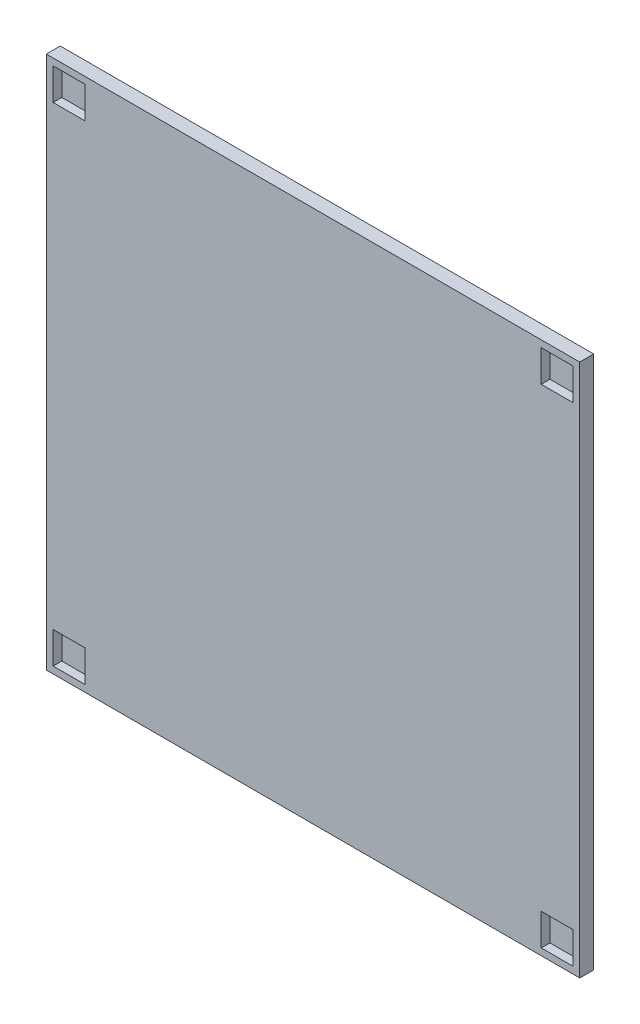
ISO-10303-21;
HEADER;
FILE_DESCRIPTION(('STEP AP214'),'2;1');
FILE_NAME('part.step','',(''),(''),'','','');
FILE_SCHEMA(('AUTOMOTIVE_DESIGN { 1 0 10303 214 1 1 1 1 }'));
ENDSEC;
DATA;
#1=APPLICATION_CONTEXT('core data for automotive mechanical design processes');
#2=APPLICATION_PROTOCOL_DEFINITION('international standard','automotive_design',2000,#1);
#3=PRODUCT_CONTEXT('',#1,'mechanical');
#4=PRODUCT('Part','Part','',(#3));
#5=PRODUCT_RELATED_PRODUCT_CATEGORY('part','',(#4));
#6=PRODUCT_DEFINITION_FORMATION('','',#4);
#7=PRODUCT_DEFINITION_CONTEXT('part definition',#1,'design');
#8=PRODUCT_DEFINITION('design','',#6,#7);
#9=PRODUCT_DEFINITION_SHAPE('','',#8);
#10=(LENGTH_UNIT() NAMED_UNIT(*) SI_UNIT(.MILLI.,.METRE.));
#11=(NAMED_UNIT(*) PLANE_ANGLE_UNIT() SI_UNIT($,.RADIAN.));
#12=(NAMED_UNIT(*) SI_UNIT($,.STERADIAN.) SOLID_ANGLE_UNIT());
#13=UNCERTAINTY_MEASURE_WITH_UNIT(LENGTH_MEASURE(1.E-05),#10,'distance_accuracy_value','');
#14=(GEOMETRIC_REPRESENTATION_CONTEXT(3) GLOBAL_UNCERTAINTY_ASSIGNED_CONTEXT((#13)) GLOBAL_UNIT_ASSIGNED_CONTEXT((#10,
#11,#12)) REPRESENTATION_CONTEXT('',''));
#15=CARTESIAN_POINT('',(0.,0.,0.));
#16=DIRECTION('',(0.,0.,1.));
#17=DIRECTION('',(1.,0.,0.));
#18=AXIS2_PLACEMENT_3D('',#15,#16,#17);
#19=CARTESIAN_POINT('',(-153.,-153.,8.));
#20=DIRECTION('',(1.,0.,0.));
#21=DIRECTION('',(0.,0.,-1.));
#22=AXIS2_PLACEMENT_3D('',#19,#20,#21);
#23=PLANE('',#22);
#24=DIRECTION('',(0.,-1.,0.));
#25=VECTOR('',#24,1.);
#26=CARTESIAN_POINT('',(-153.,-153.,0.));
#27=LINE('',#26,#25);
#28=CARTESIAN_POINT('',(-153.,153.,0.));
#29=VERTEX_POINT('',#28);
#30=CARTESIAN_POINT('',(-153.,-153.,0.));
#31=VERTEX_POINT('',#30);
#32=EDGE_CURVE('E302',#29,#31,#27,.T.);
#33=ORIENTED_EDGE('',*,*,#32,.T.);
#34=DIRECTION('',(0.,0.,-1.));
#35=VECTOR('',#34,1.);
#36=CARTESIAN_POINT('',(-153.,-153.,8.));
#37=LINE('',#36,#35);
#38=CARTESIAN_POINT('',(-153.,-153.,8.));
#39=VERTEX_POINT('',#38);
#40=EDGE_CURVE('E11',#39,#31,#37,.T.);
#41=ORIENTED_EDGE('',*,*,#40,.F.);
#42=DIRECTION('',(0.,-1.,0.));
#43=VECTOR('',#42,1.);
#44=CARTESIAN_POINT('',(-153.,-153.,8.));
#45=LINE('',#44,#43);
#46=CARTESIAN_POINT('',(-153.,153.,8.));
#47=VERTEX_POINT('',#46);
#48=EDGE_CURVE('E309',#47,#39,#45,.T.);
#49=ORIENTED_EDGE('',*,*,#48,.F.);
#50=DIRECTION('',(0.,0.,-1.));
#51=VECTOR('',#50,1.);
#52=CARTESIAN_POINT('',(-153.,153.,8.));
#53=LINE('',#52,#51);
#54=EDGE_CURVE('E317',#47,#29,#53,.T.);
#55=ORIENTED_EDGE('',*,*,#54,.T.);
#56=EDGE_LOOP('',(#33,#41,#49,#55));
#57=FACE_BOUND('',#56,.T.);
#58=ADVANCED_FACE('F41',(#57),#23,.F.);
#59=CARTESIAN_POINT('',(-153.,-153.,8.));
#60=DIRECTION('',(0.,1.,0.));
#61=DIRECTION('',(0.,0.,1.));
#62=AXIS2_PLACEMENT_3D('',#59,#60,#61);
#63=PLANE('',#62);
#64=DIRECTION('',(1.,0.,0.));
#65=VECTOR('',#64,1.);
#66=CARTESIAN_POINT('',(-153.,-153.,0.));
#67=LINE('',#66,#65);
#68=CARTESIAN_POINT('',(153.,-153.,0.));
#69=VERTEX_POINT('',#68);
#70=EDGE_CURVE('E325',#31,#69,#67,.T.);
#71=ORIENTED_EDGE('',*,*,#70,.T.);
#72=DIRECTION('',(0.,0.,-1.));
#73=VECTOR('',#72,1.);
#74=CARTESIAN_POINT('',(153.,-153.,8.));
#75=LINE('',#74,#73);
#76=CARTESIAN_POINT('',(153.,-153.,8.));
#77=VERTEX_POINT('',#76);
#78=EDGE_CURVE('E48',#77,#69,#75,.T.);
#79=ORIENTED_EDGE('',*,*,#78,.F.);
#80=DIRECTION('',(1.,0.,0.));
#81=VECTOR('',#80,1.);
#82=CARTESIAN_POINT('',(-153.,-153.,8.));
#83=LINE('',#82,#81);
#84=EDGE_CURVE('E315',#39,#77,#83,.T.);
#85=ORIENTED_EDGE('',*,*,#84,.F.);
#86=ORIENTED_EDGE('',*,*,#40,.T.);
#87=EDGE_LOOP('',(#71,#79,#85,#86));
#88=FACE_BOUND('',#87,.T.);
#89=ADVANCED_FACE('F353',(#88),#63,.F.);
#90=CARTESIAN_POINT('',(153.,-153.,8.));
#91=DIRECTION('',(-1.,0.,0.));
#92=DIRECTION('',(0.,0.,1.));
#93=AXIS2_PLACEMENT_3D('',#90,#91,#92);
#94=PLANE('',#93);
#95=DIRECTION('',(0.,1.,0.));
#96=VECTOR('',#95,1.);
#97=CARTESIAN_POINT('',(153.,-153.,0.));
#98=LINE('',#97,#96);
#99=CARTESIAN_POINT('',(153.,153.,0.));
#100=VERTEX_POINT('',#99);
#101=EDGE_CURVE('E323',#69,#100,#98,.T.);
#102=ORIENTED_EDGE('',*,*,#101,.T.);
#103=DIRECTION('',(0.,0.,-1.));
#104=VECTOR('',#103,1.);
#105=CARTESIAN_POINT('',(153.,153.,8.));
#106=LINE('',#105,#104);
#107=CARTESIAN_POINT('',(153.,153.,8.));
#108=VERTEX_POINT('',#107);
#109=EDGE_CURVE('E326',#108,#100,#106,.T.);
#110=ORIENTED_EDGE('',*,*,#109,.F.);
#111=DIRECTION('',(0.,1.,0.));
#112=VECTOR('',#111,1.);
#113=CARTESIAN_POINT('',(153.,-153.,8.));
#114=LINE('',#113,#112);
#115=EDGE_CURVE('E314',#77,#108,#114,.T.);
#116=ORIENTED_EDGE('',*,*,#115,.F.);
#117=ORIENTED_EDGE('',*,*,#78,.T.);
#118=EDGE_LOOP('',(#102,#110,#116,#117));
#119=FACE_BOUND('',#118,.T.);
#120=ADVANCED_FACE('F337',(#119),#94,.F.);
#121=CARTESIAN_POINT('',(-153.,153.,8.));
#122=DIRECTION('',(0.,-1.,0.));
#123=DIRECTION('',(0.,0.,-1.));
#124=AXIS2_PLACEMENT_3D('',#121,#122,#123);
#125=PLANE('',#124);
#126=DIRECTION('',(-1.,0.,0.));
#127=VECTOR('',#126,1.);
#128=CARTESIAN_POINT('',(-153.,153.,0.));
#129=LINE('',#128,#127);
#130=EDGE_CURVE('E313',#100,#29,#129,.T.);
#131=ORIENTED_EDGE('',*,*,#130,.T.);
#132=ORIENTED_EDGE('',*,*,#54,.F.);
#133=DIRECTION('',(-1.,0.,0.));
#134=VECTOR('',#133,1.);
#135=CARTESIAN_POINT('',(-153.,153.,8.));
#136=LINE('',#135,#134);
#137=EDGE_CURVE('E320',#108,#47,#136,.T.);
#138=ORIENTED_EDGE('',*,*,#137,.F.);
#139=ORIENTED_EDGE('',*,*,#109,.T.);
#140=EDGE_LOOP('',(#131,#132,#138,#139));
#141=FACE_BOUND('',#140,.T.);
#142=ADVANCED_FACE('F341',(#141),#125,.F.);
#143=CARTESIAN_POINT('',(0.,0.,8.));
#144=DIRECTION('',(0.,0.,-1.));
#145=DIRECTION('',(-1.,0.,0.));
#146=AXIS2_PLACEMENT_3D('',#143,#144,#145);
#147=PLANE('',#146);
#148=DIRECTION('',(1.,0.,0.));
#149=VECTOR('',#148,1.);
#150=CARTESIAN_POINT('',(-149.1,130.9,8.));
#151=LINE('',#150,#149);
#152=CARTESIAN_POINT('',(-149.1,130.9,8.));
#153=VERTEX_POINT('',#152);
#154=CARTESIAN_POINT('',(-130.9,130.9,8.));
#155=VERTEX_POINT('',#154);
#156=EDGE_CURVE('E234',#153,#155,#151,.T.);
#157=ORIENTED_EDGE('',*,*,#156,.F.);
#158=DIRECTION('',(0.,-1.,0.));
#159=VECTOR('',#158,1.);
#160=CARTESIAN_POINT('',(-149.1,149.1,8.));
#161=LINE('',#160,#159);
#162=CARTESIAN_POINT('',(-149.1,149.1,8.));
#163=VERTEX_POINT('',#162);
#164=EDGE_CURVE('E54',#163,#153,#161,.T.);
#165=ORIENTED_EDGE('',*,*,#164,.F.);
#166=DIRECTION('',(-1.,0.,0.));
#167=VECTOR('',#166,1.);
#168=CARTESIAN_POINT('',(-130.9,149.1,8.));
#169=LINE('',#168,#167);
#170=CARTESIAN_POINT('',(-130.9,149.1,8.));
#171=VERTEX_POINT('',#170);
#172=EDGE_CURVE('E228',#171,#163,#169,.T.);
#173=ORIENTED_EDGE('',*,*,#172,.F.);
#174=DIRECTION('',(0.,1.,0.));
#175=VECTOR('',#174,1.);
#176=CARTESIAN_POINT('',(-130.9,130.9,8.));
#177=LINE('',#176,#175);
#178=EDGE_CURVE('E231',#155,#171,#177,.T.);
#179=ORIENTED_EDGE('',*,*,#178,.F.);
#180=EDGE_LOOP('',(#157,#165,#173,#179));
#181=FACE_BOUND('',#180,.T.);
#182=DIRECTION('',(1.,0.,0.));
#183=VECTOR('',#182,1.);
#184=CARTESIAN_POINT('',(130.9,-149.1,8.));
#185=LINE('',#184,#183);
#186=CARTESIAN_POINT('',(130.9,-149.1,8.));
#187=VERTEX_POINT('',#186);
#188=CARTESIAN_POINT('',(149.1,-149.1,8.));
#189=VERTEX_POINT('',#188);
#190=EDGE_CURVE('E261',#187,#189,#185,.T.);
#191=ORIENTED_EDGE('',*,*,#190,.F.);
#192=DIRECTION('',(0.,-1.,0.));
#193=VECTOR('',#192,1.);
#194=CARTESIAN_POINT('',(130.9,-130.9,8.));
#195=LINE('',#194,#193);
#196=CARTESIAN_POINT('',(130.9,-130.9,8.));
#197=VERTEX_POINT('',#196);
#198=EDGE_CURVE('E63',#197,#187,#195,.T.);
#199=ORIENTED_EDGE('',*,*,#198,.F.);
#200=DIRECTION('',(-1.,0.,0.));
#201=VECTOR('',#200,1.);
#202=CARTESIAN_POINT('',(149.1,-130.9,8.));
#203=LINE('',#202,#201);
#204=CARTESIAN_POINT('',(149.1,-130.9,8.));
#205=VERTEX_POINT('',#204);
#206=EDGE_CURVE('E258',#205,#197,#203,.T.);
#207=ORIENTED_EDGE('',*,*,#206,.F.);
#208=DIRECTION('',(0.,1.,0.));
#209=VECTOR('',#208,1.);
#210=CARTESIAN_POINT('',(149.1,-149.1,8.));
#211=LINE('',#210,#209);
#212=EDGE_CURVE('E260',#189,#205,#211,.T.);
#213=ORIENTED_EDGE('',*,*,#212,.F.);
#214=EDGE_LOOP('',(#191,#199,#207,#213));
#215=FACE_BOUND('',#214,.T.);
#216=DIRECTION('',(1.,0.,0.));
#217=VECTOR('',#216,1.);
#218=CARTESIAN_POINT('',(-149.1,-149.1,8.));
#219=LINE('',#218,#217);
#220=CARTESIAN_POINT('',(-149.1,-149.1,8.));
#221=VERTEX_POINT('',#220);
#222=CARTESIAN_POINT('',(-130.9,-149.1,8.));
#223=VERTEX_POINT('',#222);
#224=EDGE_CURVE('E202',#221,#223,#219,.T.);
#225=ORIENTED_EDGE('',*,*,#224,.F.);
#226=DIRECTION('',(0.,-1.,0.));
#227=VECTOR('',#226,1.);
#228=CARTESIAN_POINT('',(-149.1,-130.9,8.));
#229=LINE('',#228,#227);
#230=CARTESIAN_POINT('',(-149.1,-130.9,8.));
#231=VERTEX_POINT('',#230);
#232=EDGE_CURVE('E179',#231,#221,#229,.T.);
#233=ORIENTED_EDGE('',*,*,#232,.F.);
#234=DIRECTION('',(-1.,0.,0.));
#235=VECTOR('',#234,1.);
#236=CARTESIAN_POINT('',(-130.9,-130.9,8.));
#237=LINE('',#236,#235);
#238=CARTESIAN_POINT('',(-130.9,-130.9,8.));
#239=VERTEX_POINT('',#238);
#240=EDGE_CURVE('E189',#239,#231,#237,.T.);
#241=ORIENTED_EDGE('',*,*,#240,.F.);
#242=DIRECTION('',(0.,1.,0.));
#243=VECTOR('',#242,1.);
#244=CARTESIAN_POINT('',(-130.9,-149.1,8.));
#245=LINE('',#244,#243);
#246=EDGE_CURVE('E193',#223,#239,#245,.T.);
#247=ORIENTED_EDGE('',*,*,#246,.F.);
#248=EDGE_LOOP('',(#225,#233,#241,#247));
#249=FACE_BOUND('',#248,.T.);
#250=DIRECTION('',(1.,0.,0.));
#251=VECTOR('',#250,1.);
#252=CARTESIAN_POINT('',(130.9,130.9,8.));
#253=LINE('',#252,#251);
#254=CARTESIAN_POINT('',(130.9,130.9,8.));
#255=VERTEX_POINT('',#254);
#256=CARTESIAN_POINT('',(149.1,130.9,8.));
#257=VERTEX_POINT('',#256);
#258=EDGE_CURVE('E295',#255,#257,#253,.T.);
#259=ORIENTED_EDGE('',*,*,#258,.F.);
#260=DIRECTION('',(0.,-1.,0.));
#261=VECTOR('',#260,1.);
#262=CARTESIAN_POINT('',(130.9,149.1,8.));
#263=LINE('',#262,#261);
#264=CARTESIAN_POINT('',(130.9,149.1,8.));
#265=VERTEX_POINT('',#264);
#266=EDGE_CURVE('E236',#265,#255,#263,.T.);
#267=ORIENTED_EDGE('',*,*,#266,.F.);
#268=DIRECTION('',(-1.,0.,0.));
#269=VECTOR('',#268,1.);
#270=CARTESIAN_POINT('',(149.1,149.1,8.));
#271=LINE('',#270,#269);
#272=CARTESIAN_POINT('',(149.1,149.1,8.));
#273=VERTEX_POINT('',#272);
#274=EDGE_CURVE('E282',#273,#265,#271,.T.);
#275=ORIENTED_EDGE('',*,*,#274,.F.);
#276=DIRECTION('',(0.,1.,0.));
#277=VECTOR('',#276,1.);
#278=CARTESIAN_POINT('',(149.1,130.9,8.));
#279=LINE('',#278,#277);
#280=EDGE_CURVE('E293',#257,#273,#279,.T.);
#281=ORIENTED_EDGE('',*,*,#280,.F.);
#282=EDGE_LOOP('',(#259,#267,#275,#281));
#283=FACE_BOUND('',#282,.T.);
#284=ORIENTED_EDGE('',*,*,#48,.T.);
#285=ORIENTED_EDGE('',*,*,#84,.T.);
#286=ORIENTED_EDGE('',*,*,#115,.T.);
#287=ORIENTED_EDGE('',*,*,#137,.T.);
#288=EDGE_LOOP('',(#284,#285,#286,#287));
#289=FACE_BOUND('',#288,.T.);
#290=ADVANCED_FACE('F198',(#181,#215,#249,#283,#289),#147,.F.);
#291=CARTESIAN_POINT('',(0.,0.,0.));
#292=DIRECTION('',(0.,0.,-1.));
#293=DIRECTION('',(-1.,0.,0.));
#294=AXIS2_PLACEMENT_3D('',#291,#292,#293);
#295=PLANE('',#294);
#296=ORIENTED_EDGE('',*,*,#32,.F.);
#297=ORIENTED_EDGE('',*,*,#130,.F.);
#298=ORIENTED_EDGE('',*,*,#101,.F.);
#299=ORIENTED_EDGE('',*,*,#70,.F.);
#300=EDGE_LOOP('',(#296,#297,#298,#299));
#301=FACE_BOUND('',#300,.T.);
#302=ADVANCED_FACE('F345',(#301),#295,.T.);
#303=CARTESIAN_POINT('',(130.9,149.1,3.));
#304=DIRECTION('',(-1.,0.,0.));
#305=DIRECTION('',(0.,0.,1.));
#306=AXIS2_PLACEMENT_3D('',#303,#304,#305);
#307=PLANE('',#306);
#308=ORIENTED_EDGE('',*,*,#266,.T.);
#309=DIRECTION('',(0.,0.,1.));
#310=VECTOR('',#309,1.);
#311=CARTESIAN_POINT('',(130.9,130.9,3.));
#312=LINE('',#311,#310);
#313=CARTESIAN_POINT('',(130.9,130.9,3.));
#314=VERTEX_POINT('',#313);
#315=EDGE_CURVE('E286',#314,#255,#312,.T.);
#316=ORIENTED_EDGE('',*,*,#315,.F.);
#317=DIRECTION('',(0.,-1.,0.));
#318=VECTOR('',#317,1.);
#319=CARTESIAN_POINT('',(130.9,149.1,3.));
#320=LINE('',#319,#318);
#321=CARTESIAN_POINT('',(130.9,149.1,3.));
#322=VERTEX_POINT('',#321);
#323=EDGE_CURVE('E280',#322,#314,#320,.T.);
#324=ORIENTED_EDGE('',*,*,#323,.F.);
#325=DIRECTION('',(0.,0.,1.));
#326=VECTOR('',#325,1.);
#327=CARTESIAN_POINT('',(130.9,149.1,3.));
#328=LINE('',#327,#326);
#329=EDGE_CURVE('E296',#322,#265,#328,.T.);
#330=ORIENTED_EDGE('',*,*,#329,.T.);
#331=EDGE_LOOP('',(#308,#316,#324,#330));
#332=FACE_BOUND('',#331,.T.);
#333=ADVANCED_FACE('F363',(#332),#307,.F.);
#334=CARTESIAN_POINT('',(149.1,149.1,3.));
#335=DIRECTION('',(0.,1.,0.));
#336=DIRECTION('',(0.,0.,1.));
#337=AXIS2_PLACEMENT_3D('',#334,#335,#336);
#338=PLANE('',#337);
#339=ORIENTED_EDGE('',*,*,#274,.T.);
#340=ORIENTED_EDGE('',*,*,#329,.F.);
#341=DIRECTION('',(-1.,0.,0.));
#342=VECTOR('',#341,1.);
#343=CARTESIAN_POINT('',(149.1,149.1,3.));
#344=LINE('',#343,#342);
#345=CARTESIAN_POINT('',(149.1,149.1,3.));
#346=VERTEX_POINT('',#345);
#347=EDGE_CURVE('E290',#346,#322,#344,.T.);
#348=ORIENTED_EDGE('',*,*,#347,.F.);
#349=DIRECTION('',(0.,0.,1.));
#350=VECTOR('',#349,1.);
#351=CARTESIAN_POINT('',(149.1,149.1,3.));
#352=LINE('',#351,#350);
#353=EDGE_CURVE('E301',#346,#273,#352,.T.);
#354=ORIENTED_EDGE('',*,*,#353,.T.);
#355=EDGE_LOOP('',(#339,#340,#348,#354));
#356=FACE_BOUND('',#355,.T.);
#357=ADVANCED_FACE('F368',(#356),#338,.F.);
#358=CARTESIAN_POINT('',(149.1,130.9,3.));
#359=DIRECTION('',(1.,0.,0.));
#360=DIRECTION('',(0.,0.,-1.));
#361=AXIS2_PLACEMENT_3D('',#358,#359,#360);
#362=PLANE('',#361);
#363=ORIENTED_EDGE('',*,*,#280,.T.);
#364=ORIENTED_EDGE('',*,*,#353,.F.);
#365=DIRECTION('',(0.,1.,0.));
#366=VECTOR('',#365,1.);
#367=CARTESIAN_POINT('',(149.1,130.9,3.));
#368=LINE('',#367,#366);
#369=CARTESIAN_POINT('',(149.1,130.9,3.));
#370=VERTEX_POINT('',#369);
#371=EDGE_CURVE('E281',#370,#346,#368,.T.);
#372=ORIENTED_EDGE('',*,*,#371,.F.);
#373=DIRECTION('',(0.,0.,1.));
#374=VECTOR('',#373,1.);
#375=CARTESIAN_POINT('',(149.1,130.9,3.));
#376=LINE('',#375,#374);
#377=EDGE_CURVE('E304',#370,#257,#376,.T.);
#378=ORIENTED_EDGE('',*,*,#377,.T.);
#379=EDGE_LOOP('',(#363,#364,#372,#378));
#380=FACE_BOUND('',#379,.T.);
#381=ADVANCED_FACE('F373',(#380),#362,.F.);
#382=CARTESIAN_POINT('',(130.9,130.9,3.));
#383=DIRECTION('',(0.,-1.,0.));
#384=DIRECTION('',(0.,0.,-1.));
#385=AXIS2_PLACEMENT_3D('',#382,#383,#384);
#386=PLANE('',#385);
#387=ORIENTED_EDGE('',*,*,#258,.T.);
#388=ORIENTED_EDGE('',*,*,#377,.F.);
#389=DIRECTION('',(1.,0.,0.));
#390=VECTOR('',#389,1.);
#391=CARTESIAN_POINT('',(130.9,130.9,3.));
#392=LINE('',#391,#390);
#393=EDGE_CURVE('E279',#314,#370,#392,.T.);
#394=ORIENTED_EDGE('',*,*,#393,.F.);
#395=ORIENTED_EDGE('',*,*,#315,.T.);
#396=EDGE_LOOP('',(#387,#388,#394,#395));
#397=FACE_BOUND('',#396,.T.);
#398=ADVANCED_FACE('F372',(#397),#386,.F.);
#399=CARTESIAN_POINT('',(0.,0.,3.));
#400=DIRECTION('',(0.,0.,1.));
#401=DIRECTION('',(1.,0.,0.));
#402=AXIS2_PLACEMENT_3D('',#399,#400,#401);
#403=PLANE('',#402);
#404=ORIENTED_EDGE('',*,*,#323,.T.);
#405=ORIENTED_EDGE('',*,*,#393,.T.);
#406=ORIENTED_EDGE('',*,*,#371,.T.);
#407=ORIENTED_EDGE('',*,*,#347,.T.);
#408=EDGE_LOOP('',(#404,#405,#406,#407));
#409=FACE_BOUND('',#408,.T.);
#410=ADVANCED_FACE('F371',(#409),#403,.T.);
#411=CARTESIAN_POINT('',(-149.1,-130.9,3.));
#412=DIRECTION('',(-1.,0.,0.));
#413=DIRECTION('',(0.,0.,1.));
#414=AXIS2_PLACEMENT_3D('',#411,#412,#413);
#415=PLANE('',#414);
#416=ORIENTED_EDGE('',*,*,#232,.T.);
#417=DIRECTION('',(0.,0.,1.));
#418=VECTOR('',#417,1.);
#419=CARTESIAN_POINT('',(-149.1,-149.1,3.));
#420=LINE('',#419,#418);
#421=CARTESIAN_POINT('',(-149.1,-149.1,3.));
#422=VERTEX_POINT('',#421);
#423=EDGE_CURVE('E212',#422,#221,#420,.T.);
#424=ORIENTED_EDGE('',*,*,#423,.F.);
#425=DIRECTION('',(0.,-1.,0.));
#426=VECTOR('',#425,1.);
#427=CARTESIAN_POINT('',(-149.1,-130.9,3.));
#428=LINE('',#427,#426);
#429=CARTESIAN_POINT('',(-149.1,-130.9,3.));
#430=VERTEX_POINT('',#429);
#431=EDGE_CURVE('E183',#430,#422,#428,.T.);
#432=ORIENTED_EDGE('',*,*,#431,.F.);
#433=DIRECTION('',(0.,0.,1.));
#434=VECTOR('',#433,1.);
#435=CARTESIAN_POINT('',(-149.1,-130.9,3.));
#436=LINE('',#435,#434);
#437=EDGE_CURVE('E176',#430,#231,#436,.T.);
#438=ORIENTED_EDGE('',*,*,#437,.T.);
#439=EDGE_LOOP('',(#416,#424,#432,#438));
#440=FACE_BOUND('',#439,.T.);
#441=ADVANCED_FACE('F178',(#440),#415,.F.);
#442=CARTESIAN_POINT('',(-130.9,-130.9,3.));
#443=DIRECTION('',(0.,1.,0.));
#444=DIRECTION('',(0.,0.,1.));
#445=AXIS2_PLACEMENT_3D('',#442,#443,#444);
#446=PLANE('',#445);
#447=ORIENTED_EDGE('',*,*,#240,.T.);
#448=ORIENTED_EDGE('',*,*,#437,.F.);
#449=DIRECTION('',(-1.,0.,0.));
#450=VECTOR('',#449,1.);
#451=CARTESIAN_POINT('',(-130.9,-130.9,3.));
#452=LINE('',#451,#450);
#453=CARTESIAN_POINT('',(-130.9,-130.9,3.));
#454=VERTEX_POINT('',#453);
#455=EDGE_CURVE('E209',#454,#430,#452,.T.);
#456=ORIENTED_EDGE('',*,*,#455,.F.);
#457=DIRECTION('',(0.,0.,1.));
#458=VECTOR('',#457,1.);
#459=CARTESIAN_POINT('',(-130.9,-130.9,3.));
#460=LINE('',#459,#458);
#461=EDGE_CURVE('E190',#454,#239,#460,.T.);
#462=ORIENTED_EDGE('',*,*,#461,.T.);
#463=EDGE_LOOP('',(#447,#448,#456,#462));
#464=FACE_BOUND('',#463,.T.);
#465=ADVANCED_FACE('F192',(#464),#446,.F.);
#466=CARTESIAN_POINT('',(-130.9,-149.1,3.));
#467=DIRECTION('',(1.,0.,0.));
#468=DIRECTION('',(0.,0.,-1.));
#469=AXIS2_PLACEMENT_3D('',#466,#467,#468);
#470=PLANE('',#469);
#471=ORIENTED_EDGE('',*,*,#246,.T.);
#472=ORIENTED_EDGE('',*,*,#461,.F.);
#473=DIRECTION('',(0.,1.,0.));
#474=VECTOR('',#473,1.);
#475=CARTESIAN_POINT('',(-130.9,-149.1,3.));
#476=LINE('',#475,#474);
#477=CARTESIAN_POINT('',(-130.9,-149.1,3.));
#478=VERTEX_POINT('',#477);
#479=EDGE_CURVE('E213',#478,#454,#476,.T.);
#480=ORIENTED_EDGE('',*,*,#479,.F.);
#481=DIRECTION('',(0.,0.,1.));
#482=VECTOR('',#481,1.);
#483=CARTESIAN_POINT('',(-130.9,-149.1,3.));
#484=LINE('',#483,#482);
#485=EDGE_CURVE('E593',#478,#223,#484,.T.);
#486=ORIENTED_EDGE('',*,*,#485,.T.);
#487=EDGE_LOOP('',(#471,#472,#480,#486));
#488=FACE_BOUND('',#487,.T.);
#489=ADVANCED_FACE('F432',(#488),#470,.F.);
#490=CARTESIAN_POINT('',(-149.1,-149.1,3.));
#491=DIRECTION('',(0.,-1.,0.));
#492=DIRECTION('',(0.,0.,-1.));
#493=AXIS2_PLACEMENT_3D('',#490,#491,#492);
#494=PLANE('',#493);
#495=ORIENTED_EDGE('',*,*,#224,.T.);
#496=ORIENTED_EDGE('',*,*,#485,.F.);
#497=DIRECTION('',(1.,0.,0.));
#498=VECTOR('',#497,1.);
#499=CARTESIAN_POINT('',(-149.1,-149.1,3.));
#500=LINE('',#499,#498);
#501=EDGE_CURVE('E214',#422,#478,#500,.T.);
#502=ORIENTED_EDGE('',*,*,#501,.F.);
#503=ORIENTED_EDGE('',*,*,#423,.T.);
#504=EDGE_LOOP('',(#495,#496,#502,#503));
#505=FACE_BOUND('',#504,.T.);
#506=ADVANCED_FACE('F430',(#505),#494,.F.);
#507=CARTESIAN_POINT('',(0.,0.,3.));
#508=DIRECTION('',(0.,0.,1.));
#509=DIRECTION('',(1.,0.,0.));
#510=AXIS2_PLACEMENT_3D('',#507,#508,#509);
#511=PLANE('',#510);
#512=ORIENTED_EDGE('',*,*,#431,.T.);
#513=ORIENTED_EDGE('',*,*,#501,.T.);
#514=ORIENTED_EDGE('',*,*,#479,.T.);
#515=ORIENTED_EDGE('',*,*,#455,.T.);
#516=EDGE_LOOP('',(#512,#513,#514,#515));
#517=FACE_BOUND('',#516,.T.);
#518=ADVANCED_FACE('F406',(#517),#511,.T.);
#519=CARTESIAN_POINT('',(130.9,-130.9,3.));
#520=DIRECTION('',(-1.,0.,0.));
#521=DIRECTION('',(0.,0.,1.));
#522=AXIS2_PLACEMENT_3D('',#519,#520,#521);
#523=PLANE('',#522);
#524=ORIENTED_EDGE('',*,*,#198,.T.);
#525=DIRECTION('',(0.,0.,1.));
#526=VECTOR('',#525,1.);
#527=CARTESIAN_POINT('',(130.9,-149.1,3.));
#528=LINE('',#527,#526);
#529=CARTESIAN_POINT('',(130.9,-149.1,3.));
#530=VERTEX_POINT('',#529);
#531=EDGE_CURVE('E248',#530,#187,#528,.T.);
#532=ORIENTED_EDGE('',*,*,#531,.F.);
#533=DIRECTION('',(0.,-1.,0.));
#534=VECTOR('',#533,1.);
#535=CARTESIAN_POINT('',(130.9,-130.9,3.));
#536=LINE('',#535,#534);
#537=CARTESIAN_POINT('',(130.9,-130.9,3.));
#538=VERTEX_POINT('',#537);
#539=EDGE_CURVE('E259',#538,#530,#536,.T.);
#540=ORIENTED_EDGE('',*,*,#539,.F.);
#541=DIRECTION('',(0.,0.,1.));
#542=VECTOR('',#541,1.);
#543=CARTESIAN_POINT('',(130.9,-130.9,3.));
#544=LINE('',#543,#542);
#545=EDGE_CURVE('E205',#538,#197,#544,.T.);
#546=ORIENTED_EDGE('',*,*,#545,.T.);
#547=EDGE_LOOP('',(#524,#532,#540,#546));
#548=FACE_BOUND('',#547,.T.);
#549=ADVANCED_FACE('F398',(#548),#523,.F.);
#550=CARTESIAN_POINT('',(149.1,-130.9,3.));
#551=DIRECTION('',(0.,1.,0.));
#552=DIRECTION('',(0.,0.,1.));
#553=AXIS2_PLACEMENT_3D('',#550,#551,#552);
#554=PLANE('',#553);
#555=ORIENTED_EDGE('',*,*,#206,.T.);
#556=ORIENTED_EDGE('',*,*,#545,.F.);
#557=DIRECTION('',(-1.,0.,0.));
#558=VECTOR('',#557,1.);
#559=CARTESIAN_POINT('',(149.1,-130.9,3.));
#560=LINE('',#559,#558);
#561=CARTESIAN_POINT('',(149.1,-130.9,3.));
#562=VERTEX_POINT('',#561);
#563=EDGE_CURVE('E255',#562,#538,#560,.T.);
#564=ORIENTED_EDGE('',*,*,#563,.F.);
#565=DIRECTION('',(0.,0.,1.));
#566=VECTOR('',#565,1.);
#567=CARTESIAN_POINT('',(149.1,-130.9,3.));
#568=LINE('',#567,#566);
#569=EDGE_CURVE('E204',#562,#205,#568,.T.);
#570=ORIENTED_EDGE('',*,*,#569,.T.);
#571=EDGE_LOOP('',(#555,#556,#564,#570));
#572=FACE_BOUND('',#571,.T.);
#573=ADVANCED_FACE('F392',(#572),#554,.F.);
#574=CARTESIAN_POINT('',(149.1,-149.1,3.));
#575=DIRECTION('',(1.,0.,0.));
#576=DIRECTION('',(0.,0.,-1.));
#577=AXIS2_PLACEMENT_3D('',#574,#575,#576);
#578=PLANE('',#577);
#579=ORIENTED_EDGE('',*,*,#212,.T.);
#580=ORIENTED_EDGE('',*,*,#569,.F.);
#581=DIRECTION('',(0.,1.,0.));
#582=VECTOR('',#581,1.);
#583=CARTESIAN_POINT('',(149.1,-149.1,3.));
#584=LINE('',#583,#582);
#585=CARTESIAN_POINT('',(149.1,-149.1,3.));
#586=VERTEX_POINT('',#585);
#587=EDGE_CURVE('E267',#586,#562,#584,.T.);
#588=ORIENTED_EDGE('',*,*,#587,.F.);
#589=DIRECTION('',(0.,0.,1.));
#590=VECTOR('',#589,1.);
#591=CARTESIAN_POINT('',(149.1,-149.1,3.));
#592=LINE('',#591,#590);
#593=EDGE_CURVE('E253',#586,#189,#592,.T.);
#594=ORIENTED_EDGE('',*,*,#593,.T.);
#595=EDGE_LOOP('',(#579,#580,#588,#594));
#596=FACE_BOUND('',#595,.T.);
#597=ADVANCED_FACE('F394',(#596),#578,.F.);
#598=CARTESIAN_POINT('',(130.9,-149.1,3.));
#599=DIRECTION('',(0.,-1.,0.));
#600=DIRECTION('',(0.,0.,-1.));
#601=AXIS2_PLACEMENT_3D('',#598,#599,#600);
#602=PLANE('',#601);
#603=ORIENTED_EDGE('',*,*,#190,.T.);
#604=ORIENTED_EDGE('',*,*,#593,.F.);
#605=DIRECTION('',(1.,0.,0.));
#606=VECTOR('',#605,1.);
#607=CARTESIAN_POINT('',(130.9,-149.1,3.));
#608=LINE('',#607,#606);
#609=EDGE_CURVE('E275',#530,#586,#608,.T.);
#610=ORIENTED_EDGE('',*,*,#609,.F.);
#611=ORIENTED_EDGE('',*,*,#531,.T.);
#612=EDGE_LOOP('',(#603,#604,#610,#611));
#613=FACE_BOUND('',#612,.T.);
#614=ADVANCED_FACE('F386',(#613),#602,.F.);
#615=CARTESIAN_POINT('',(0.,0.,3.));
#616=DIRECTION('',(0.,0.,1.));
#617=DIRECTION('',(1.,0.,0.));
#618=AXIS2_PLACEMENT_3D('',#615,#616,#617);
#619=PLANE('',#618);
#620=ORIENTED_EDGE('',*,*,#539,.T.);
#621=ORIENTED_EDGE('',*,*,#609,.T.);
#622=ORIENTED_EDGE('',*,*,#587,.T.);
#623=ORIENTED_EDGE('',*,*,#563,.T.);
#624=EDGE_LOOP('',(#620,#621,#622,#623));
#625=FACE_BOUND('',#624,.T.);
#626=ADVANCED_FACE('F387',(#625),#619,.T.);
#627=CARTESIAN_POINT('',(-149.1,149.1,3.));
#628=DIRECTION('',(-1.,0.,0.));
#629=DIRECTION('',(0.,0.,1.));
#630=AXIS2_PLACEMENT_3D('',#627,#628,#629);
#631=PLANE('',#630);
#632=ORIENTED_EDGE('',*,*,#164,.T.);
#633=DIRECTION('',(0.,0.,1.));
#634=VECTOR('',#633,1.);
#635=CARTESIAN_POINT('',(-149.1,130.9,3.));
#636=LINE('',#635,#634);
#637=CARTESIAN_POINT('',(-149.1,130.9,3.));
#638=VERTEX_POINT('',#637);
#639=EDGE_CURVE('E219',#638,#153,#636,.T.);
#640=ORIENTED_EDGE('',*,*,#639,.F.);
#641=DIRECTION('',(0.,-1.,0.));
#642=VECTOR('',#641,1.);
#643=CARTESIAN_POINT('',(-149.1,149.1,3.));
#644=LINE('',#643,#642);
#645=CARTESIAN_POINT('',(-149.1,149.1,3.));
#646=VERTEX_POINT('',#645);
#647=EDGE_CURVE('E235',#646,#638,#644,.T.);
#648=ORIENTED_EDGE('',*,*,#647,.F.);
#649=DIRECTION('',(0.,0.,1.));
#650=VECTOR('',#649,1.);
#651=CARTESIAN_POINT('',(-149.1,149.1,3.));
#652=LINE('',#651,#650);
#653=EDGE_CURVE('E226',#646,#163,#652,.T.);
#654=ORIENTED_EDGE('',*,*,#653,.T.);
#655=EDGE_LOOP('',(#632,#640,#648,#654));
#656=FACE_BOUND('',#655,.T.);
#657=ADVANCED_FACE('F389',(#656),#631,.F.);
#658=CARTESIAN_POINT('',(-130.9,149.1,3.));
#659=DIRECTION('',(0.,1.,0.));
#660=DIRECTION('',(0.,0.,1.));
#661=AXIS2_PLACEMENT_3D('',#658,#659,#660);
#662=PLANE('',#661);
#663=ORIENTED_EDGE('',*,*,#172,.T.);
#664=ORIENTED_EDGE('',*,*,#653,.F.);
#665=DIRECTION('',(-1.,0.,0.));
#666=VECTOR('',#665,1.);
#667=CARTESIAN_POINT('',(-130.9,149.1,3.));
#668=LINE('',#667,#666);
#669=CARTESIAN_POINT('',(-130.9,149.1,3.));
#670=VERTEX_POINT('',#669);
#671=EDGE_CURVE('E221',#670,#646,#668,.T.);
#672=ORIENTED_EDGE('',*,*,#671,.F.);
#673=DIRECTION('',(0.,0.,1.));
#674=VECTOR('',#673,1.);
#675=CARTESIAN_POINT('',(-130.9,149.1,3.));
#676=LINE('',#675,#674);
#677=EDGE_CURVE('E222',#670,#171,#676,.T.);
#678=ORIENTED_EDGE('',*,*,#677,.T.);
#679=EDGE_LOOP('',(#663,#664,#672,#678));
#680=FACE_BOUND('',#679,.T.);
#681=ADVANCED_FACE('F415',(#680),#662,.F.);
#682=CARTESIAN_POINT('',(-130.9,130.9,3.));
#683=DIRECTION('',(1.,0.,0.));
#684=DIRECTION('',(0.,0.,-1.));
#685=AXIS2_PLACEMENT_3D('',#682,#683,#684);
#686=PLANE('',#685);
#687=ORIENTED_EDGE('',*,*,#178,.T.);
#688=ORIENTED_EDGE('',*,*,#677,.F.);
#689=DIRECTION('',(0.,1.,0.));
#690=VECTOR('',#689,1.);
#691=CARTESIAN_POINT('',(-130.9,130.9,3.));
#692=LINE('',#691,#690);
#693=CARTESIAN_POINT('',(-130.9,130.9,3.));
#694=VERTEX_POINT('',#693);
#695=EDGE_CURVE('E245',#694,#670,#692,.T.);
#696=ORIENTED_EDGE('',*,*,#695,.F.);
#697=DIRECTION('',(0.,0.,1.));
#698=VECTOR('',#697,1.);
#699=CARTESIAN_POINT('',(-130.9,130.9,3.));
#700=LINE('',#699,#698);
#701=EDGE_CURVE('E225',#694,#155,#700,.T.);
#702=ORIENTED_EDGE('',*,*,#701,.T.);
#703=EDGE_LOOP('',(#687,#688,#696,#702));
#704=FACE_BOUND('',#703,.T.);
#705=ADVANCED_FACE('F414',(#704),#686,.F.);
#706=CARTESIAN_POINT('',(-149.1,130.9,3.));
#707=DIRECTION('',(0.,-1.,0.));
#708=DIRECTION('',(0.,0.,-1.));
#709=AXIS2_PLACEMENT_3D('',#706,#707,#708);
#710=PLANE('',#709);
#711=ORIENTED_EDGE('',*,*,#156,.T.);
#712=ORIENTED_EDGE('',*,*,#701,.F.);
#713=DIRECTION('',(1.,0.,0.));
#714=VECTOR('',#713,1.);
#715=CARTESIAN_POINT('',(-149.1,130.9,3.));
#716=LINE('',#715,#714);
#717=EDGE_CURVE('E241',#638,#694,#716,.T.);
#718=ORIENTED_EDGE('',*,*,#717,.F.);
#719=ORIENTED_EDGE('',*,*,#639,.T.);
#720=EDGE_LOOP('',(#711,#712,#718,#719));
#721=FACE_BOUND('',#720,.T.);
#722=ADVANCED_FACE('F409',(#721),#710,.F.);
#723=CARTESIAN_POINT('',(0.,0.,3.));
#724=DIRECTION('',(0.,0.,1.));
#725=DIRECTION('',(1.,0.,0.));
#726=AXIS2_PLACEMENT_3D('',#723,#724,#725);
#727=PLANE('',#726);
#728=ORIENTED_EDGE('',*,*,#647,.T.);
#729=ORIENTED_EDGE('',*,*,#717,.T.);
#730=ORIENTED_EDGE('',*,*,#695,.T.);
#731=ORIENTED_EDGE('',*,*,#671,.T.);
#732=EDGE_LOOP('',(#728,#729,#730,#731));
#733=FACE_BOUND('',#732,.T.);
#734=ADVANCED_FACE('F410',(#733),#727,.T.);
#735=CLOSED_SHELL('',(#58,#89,#120,#142,#290,#302,#333,#357,#381,#398,#410,#441,#465,#489,#506,
#518,#549,#573,#597,#614,#626,#657,#681,#705,#722,#734));
#736=MANIFOLD_SOLID_BREP('B2',#735);
#737=ADVANCED_BREP_SHAPE_REPRESENTATION('',(#18,#736),#14);
#738=SHAPE_DEFINITION_REPRESENTATION(#9,#737);
ENDSEC;
END-ISO-10303-21;
